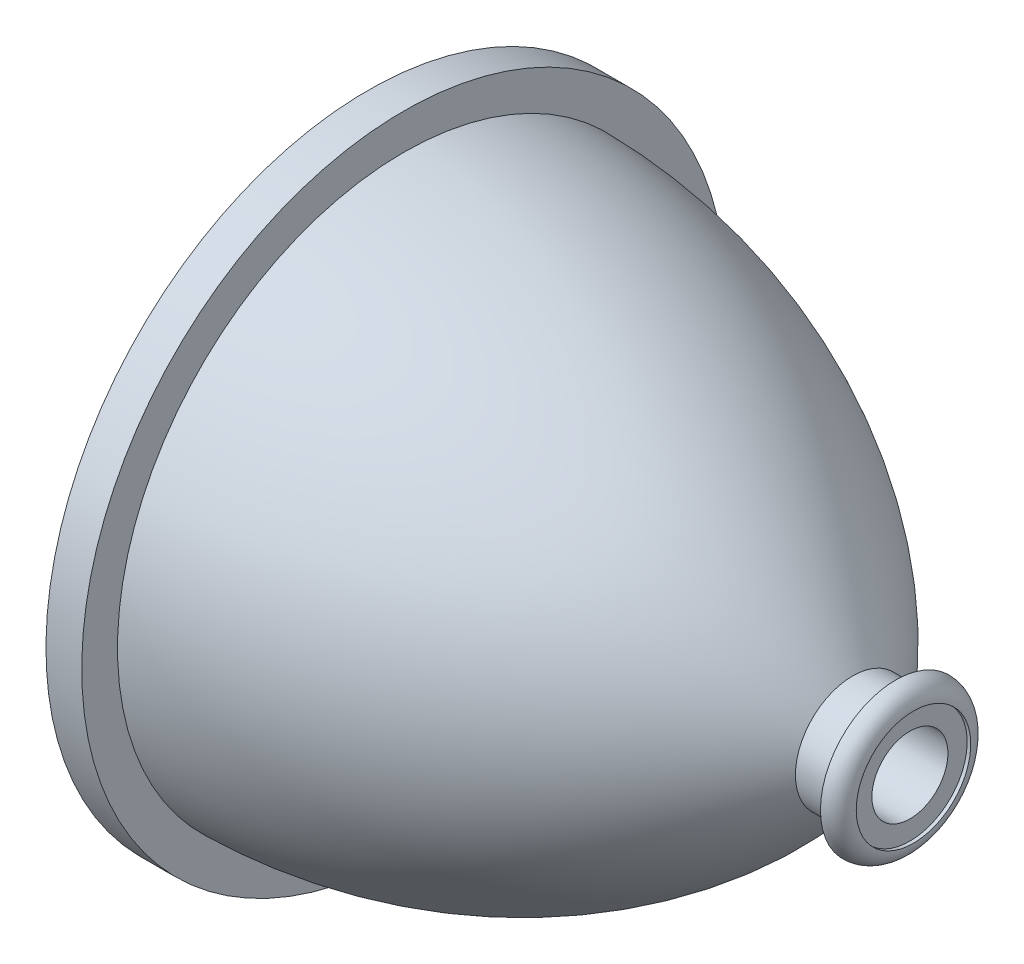
ISO-10303-21;
HEADER;
FILE_DESCRIPTION(('STEP AP214'),'2;1');
FILE_NAME('part.step','',(''),(''),'','','');
FILE_SCHEMA(('AUTOMOTIVE_DESIGN { 1 0 10303 214 1 1 1 1 }'));
ENDSEC;
DATA;
#1=APPLICATION_CONTEXT('core data for automotive mechanical design processes');
#2=APPLICATION_PROTOCOL_DEFINITION('international standard','automotive_design',2000,#1);
#3=PRODUCT_CONTEXT('',#1,'mechanical');
#4=PRODUCT('Part','Part','',(#3));
#5=PRODUCT_RELATED_PRODUCT_CATEGORY('part','',(#4));
#6=PRODUCT_DEFINITION_FORMATION('','',#4);
#7=PRODUCT_DEFINITION_CONTEXT('part definition',#1,'design');
#8=PRODUCT_DEFINITION('design','',#6,#7);
#9=PRODUCT_DEFINITION_SHAPE('','',#8);
#10=(LENGTH_UNIT() NAMED_UNIT(*) SI_UNIT(.MILLI.,.METRE.));
#11=(NAMED_UNIT(*) PLANE_ANGLE_UNIT() SI_UNIT($,.RADIAN.));
#12=(NAMED_UNIT(*) SI_UNIT($,.STERADIAN.) SOLID_ANGLE_UNIT());
#13=UNCERTAINTY_MEASURE_WITH_UNIT(LENGTH_MEASURE(1.E-05),#10,'distance_accuracy_value','');
#14=(GEOMETRIC_REPRESENTATION_CONTEXT(3) GLOBAL_UNCERTAINTY_ASSIGNED_CONTEXT((#13)) GLOBAL_UNIT_ASSIGNED_CONTEXT((#10,
#11,#12)) REPRESENTATION_CONTEXT('',''));
#15=CARTESIAN_POINT('',(0.,0.,0.));
#16=DIRECTION('',(0.,0.,1.));
#17=DIRECTION('',(1.,0.,0.));
#18=AXIS2_PLACEMENT_3D('',#15,#16,#17);
#19=CARTESIAN_POINT('',(-6.32456014520781,-0.000355181778851922,0.));
#20=DIRECTION('',(1.,0.,0.));
#21=DIRECTION('',(0.,1.,0.));
#22=AXIS2_PLACEMENT_3D('',#19,#20,#21);
#23=CYLINDRICAL_SURFACE('',#22,44.45);
#24=CARTESIAN_POINT('',(-6.32456014520781,-0.000355181778851922,0.));
#25=DIRECTION('',(-1.,0.,0.));
#26=DIRECTION('',(0.,-1.,0.));
#27=AXIS2_PLACEMENT_3D('',#24,#25,#26);
#28=CIRCLE('',#27,44.45);
#29=CARTESIAN_POINT('',(-6.32456014520781,-44.4503551817788,0.));
#30=VERTEX_POINT('',#29);
#31=EDGE_CURVE('E85',#30,#30,#28,.T.);
#32=ORIENTED_EDGE('',*,*,#31,.T.);
#33=EDGE_LOOP('',(#32));
#34=FACE_BOUND('',#33,.T.);
#35=CARTESIAN_POINT('',(0.,-0.000355181778851922,0.));
#36=DIRECTION('',(1.,0.,0.));
#37=DIRECTION('',(0.,0.,-1.));
#38=AXIS2_PLACEMENT_3D('',#35,#36,#37);
#39=CIRCLE('',#38,44.45);
#40=CARTESIAN_POINT('',(0.,-0.000355181778851922,-44.45));
#41=VERTEX_POINT('',#40);
#42=EDGE_CURVE('E90',#41,#41,#39,.T.);
#43=ORIENTED_EDGE('',*,*,#42,.T.);
#44=EDGE_LOOP('',(#43));
#45=FACE_BOUND('',#44,.T.);
#46=ADVANCED_FACE('F37',(#34,#45),#23,.F.);
#47=CARTESIAN_POINT('',(73.3416848801524,-0.000355181778851922,0.));
#48=DIRECTION('',(1.,0.,0.));
#49=DIRECTION('',(0.,1.,0.));
#50=AXIS2_PLACEMENT_3D('',#47,#48,#49);
#51=PLANE('',#50);
#52=CARTESIAN_POINT('',(73.3416848801524,-0.000355181778849412,0.));
#53=DIRECTION('',(1.,0.,0.));
#54=DIRECTION('',(0.,1.,0.));
#55=AXIS2_PLACEMENT_3D('',#52,#53,#54);
#56=CIRCLE('',#55,8.00582665572548);
#57=CARTESIAN_POINT('',(73.3416848801524,8.00547147394663,0.));
#58=VERTEX_POINT('',#57);
#59=EDGE_CURVE('E45',#58,#58,#56,.T.);
#60=ORIENTED_EDGE('',*,*,#59,.F.);
#61=EDGE_LOOP('',(#60));
#62=FACE_BOUND('',#61,.T.);
#63=CARTESIAN_POINT('',(73.3416848801524,-0.000355181778849412,0.));
#64=DIRECTION('',(-1.,0.,0.));
#65=DIRECTION('',(0.,0.,1.));
#66=AXIS2_PLACEMENT_3D('',#63,#64,#65);
#67=CIRCLE('',#66,7.61999999999999);
#68=CARTESIAN_POINT('',(73.3416848801524,-0.000355181778849412,7.61999999999999));
#69=VERTEX_POINT('',#68);
#70=EDGE_CURVE('E65',#69,#69,#67,.T.);
#71=ORIENTED_EDGE('',*,*,#70,.F.);
#72=EDGE_LOOP('',(#71));
#73=FACE_BOUND('',#72,.T.);
#74=ADVANCED_FACE('F111',(#62,#73),#51,.F.);
#75=CARTESIAN_POINT('',(-1.59804232648225,-0.000355181778849412,0.));
#76=DIRECTION('',(1.,0.,0.));
#77=DIRECTION('',(0.,1.,0.));
#78=AXIS2_PLACEMENT_3D('',#75,#76,#77);
#79=DEGENERATE_TOROIDAL_SURFACE('',#78,50.7870282349429,101.6,.F.);
#80=CARTESIAN_POINT('',(0.0254398547921975,-0.000355181778851922,0.));
#81=DIRECTION('',(1.,0.,0.));
#82=DIRECTION('',(0.,1.,0.));
#83=AXIS2_PLACEMENT_3D('',#80,#81,#82);
#84=CIRCLE('',#83,50.8);
#85=CARTESIAN_POINT('',(0.0254398547921975,50.7996448182211,0.));
#86=VERTEX_POINT('',#85);
#87=EDGE_CURVE('E52',#86,#86,#84,.T.);
#88=ORIENTED_EDGE('',*,*,#87,.T.);
#89=EDGE_LOOP('',(#88));
#90=FACE_BOUND('',#89,.T.);
#91=CARTESIAN_POINT('',(79.6916848801524,-0.000355181778851922,0.));
#92=DIRECTION('',(1.,0.,0.));
#93=DIRECTION('',(0.,1.,0.));
#94=AXIS2_PLACEMENT_3D('',#91,#92,#93);
#95=CIRCLE('',#94,10.16);
#96=CARTESIAN_POINT('',(79.6916848801524,10.1596448182211,0.));
#97=VERTEX_POINT('',#96);
#98=EDGE_CURVE('E10',#97,#97,#95,.T.);
#99=ORIENTED_EDGE('',*,*,#98,.F.);
#100=EDGE_LOOP('',(#99));
#101=FACE_BOUND('',#100,.T.);
#102=ADVANCED_FACE('F39',(#90,#101),#79,.F.);
#103=CARTESIAN_POINT('',(-1.59804232648225,-0.000355181778849412,0.));
#104=DIRECTION('',(1.,0.,0.));
#105=DIRECTION('',(0.,1.,0.));
#106=AXIS2_PLACEMENT_3D('',#103,#104,#105);
#107=DEGENERATE_TOROIDAL_SURFACE('',#106,50.7870282349429,95.25,.F.);
#108=CARTESIAN_POINT('',(2.54,-0.000355181778849412,0.));
#109=DIRECTION('',(1.,0.,0.));
#110=DIRECTION('',(0.,0.,-1.));
#111=AXIS2_PLACEMENT_3D('',#108,#109,#110);
#112=CIRCLE('',#111,44.3730427281677);
#113=CARTESIAN_POINT('',(2.54,-0.000355181778849412,-44.3730427281677));
#114=VERTEX_POINT('',#113);
#115=EDGE_CURVE('E41',#114,#114,#112,.F.);
#116=ORIENTED_EDGE('',*,*,#115,.T.);
#117=EDGE_LOOP('',(#116));
#118=FACE_BOUND('',#117,.T.);
#119=ORIENTED_EDGE('',*,*,#59,.T.);
#120=EDGE_LOOP('',(#119));
#121=FACE_BOUND('',#120,.T.);
#122=ADVANCED_FACE('F97',(#118,#121),#107,.T.);
#123=CARTESIAN_POINT('',(89.8516848801524,-0.000355181778851922,0.));
#124=DIRECTION('',(-1.,0.,0.));
#125=DIRECTION('',(0.,-1.,0.));
#126=AXIS2_PLACEMENT_3D('',#123,#124,#125);
#127=CYLINDRICAL_SURFACE('',#126,10.16);
#128=CARTESIAN_POINT('',(89.2166848801524,-0.000355181778851146,0.));
#129=DIRECTION('',(-1.,0.,0.));
#130=DIRECTION('',(0.,0.,1.));
#131=AXIS2_PLACEMENT_3D('',#128,#129,#130);
#132=CIRCLE('',#131,10.16);
#133=CARTESIAN_POINT('',(89.2166848801524,-0.000355181778851146,10.16));
#134=VERTEX_POINT('',#133);
#135=EDGE_CURVE('E77',#134,#134,#132,.T.);
#136=ORIENTED_EDGE('',*,*,#135,.T.);
#137=EDGE_LOOP('',(#136));
#138=FACE_BOUND('',#137,.T.);
#139=ORIENTED_EDGE('',*,*,#98,.T.);
#140=EDGE_LOOP('',(#139));
#141=FACE_BOUND('',#140,.T.);
#142=ADVANCED_FACE('F163',(#138,#141),#127,.T.);
#143=CARTESIAN_POINT('',(89.8516848801524,-0.000355181778851922,0.));
#144=DIRECTION('',(1.,0.,0.));
#145=DIRECTION('',(0.,1.,0.));
#146=AXIS2_PLACEMENT_3D('',#143,#144,#145);
#147=PLANE('',#146);
#148=CARTESIAN_POINT('',(89.8516848801524,-0.000355181778849412,0.));
#149=DIRECTION('',(-1.,0.,0.));
#150=DIRECTION('',(0.,0.,1.));
#151=AXIS2_PLACEMENT_3D('',#148,#149,#150);
#152=CIRCLE('',#151,6.74624);
#153=CARTESIAN_POINT('',(89.8516848801524,-0.000355181778849412,6.74624));
#154=VERTEX_POINT('',#153);
#155=EDGE_CURVE('E49',#154,#154,#152,.T.);
#156=ORIENTED_EDGE('',*,*,#155,.T.);
#157=EDGE_LOOP('',(#156));
#158=FACE_BOUND('',#157,.T.);
#159=CARTESIAN_POINT('',(89.8516848801524,-0.000355181778851146,0.));
#160=DIRECTION('',(1.,0.,0.));
#161=DIRECTION('',(0.,1.,0.));
#162=AXIS2_PLACEMENT_3D('',#159,#160,#161);
#163=CIRCLE('',#162,10.16);
#164=CARTESIAN_POINT('',(89.8516848801524,10.1596448182211,0.));
#165=VERTEX_POINT('',#164);
#166=EDGE_CURVE('E68',#165,#165,#163,.F.);
#167=ORIENTED_EDGE('',*,*,#166,.F.);
#168=EDGE_LOOP('',(#167));
#169=FACE_BOUND('',#168,.T.);
#170=ADVANCED_FACE('F159',(#158,#169),#147,.T.);
#171=CARTESIAN_POINT('',(73.3416848801524,-0.000355181778849412,0.));
#172=DIRECTION('',(-1.,0.,0.));
#173=DIRECTION('',(0.,0.,1.));
#174=AXIS2_PLACEMENT_3D('',#171,#172,#173);
#175=CYLINDRICAL_SURFACE('',#174,6.74624);
#176=ORIENTED_EDGE('',*,*,#155,.F.);
#177=EDGE_LOOP('',(#176));
#178=FACE_BOUND('',#177,.T.);
#179=CARTESIAN_POINT('',(78.4216848801524,-0.000355181778849412,0.));
#180=DIRECTION('',(-1.,0.,0.));
#181=DIRECTION('',(0.,0.,1.));
#182=AXIS2_PLACEMENT_3D('',#179,#180,#181);
#183=CIRCLE('',#182,6.74624);
#184=CARTESIAN_POINT('',(78.4216848801524,-0.000355181778849412,6.74624));
#185=VERTEX_POINT('',#184);
#186=EDGE_CURVE('E59',#185,#185,#183,.T.);
#187=ORIENTED_EDGE('',*,*,#186,.T.);
#188=EDGE_LOOP('',(#187));
#189=FACE_BOUND('',#188,.T.);
#190=ADVANCED_FACE('F155',(#178,#189),#175,.F.);
#191=CARTESIAN_POINT('',(78.4216848801524,6.74588481822115,0.));
#192=DIRECTION('',(1.,0.,0.));
#193=DIRECTION('',(0.,0.,-1.));
#194=AXIS2_PLACEMENT_3D('',#191,#192,#193);
#195=PLANE('',#194);
#196=ORIENTED_EDGE('',*,*,#186,.F.);
#197=EDGE_LOOP('',(#196));
#198=FACE_BOUND('',#197,.T.);
#199=CARTESIAN_POINT('',(78.4216848801524,-0.000355181778849412,0.));
#200=DIRECTION('',(-1.,0.,0.));
#201=DIRECTION('',(0.,0.,1.));
#202=AXIS2_PLACEMENT_3D('',#199,#200,#201);
#203=CIRCLE('',#202,7.62);
#204=CARTESIAN_POINT('',(78.4216848801524,-0.000355181778849412,7.62));
#205=VERTEX_POINT('',#204);
#206=EDGE_CURVE('E62',#205,#205,#203,.T.);
#207=ORIENTED_EDGE('',*,*,#206,.T.);
#208=EDGE_LOOP('',(#207));
#209=FACE_BOUND('',#208,.T.);
#210=ADVANCED_FACE('F151',(#198,#209),#195,.F.);
#211=CARTESIAN_POINT('',(73.3416848801524,-0.000355181778849412,0.));
#212=DIRECTION('',(-1.,0.,0.));
#213=DIRECTION('',(0.,0.,1.));
#214=AXIS2_PLACEMENT_3D('',#211,#212,#213);
#215=CYLINDRICAL_SURFACE('',#214,7.61999999999999);
#216=ORIENTED_EDGE('',*,*,#206,.F.);
#217=EDGE_LOOP('',(#216));
#218=FACE_BOUND('',#217,.T.);
#219=ORIENTED_EDGE('',*,*,#70,.T.);
#220=EDGE_LOOP('',(#219));
#221=FACE_BOUND('',#220,.T.);
#222=ADVANCED_FACE('F147',(#218,#221),#215,.F.);
#223=CARTESIAN_POINT('',(87.3116848801524,-0.000355181778851146,0.));
#224=DIRECTION('',(-1.,0.,0.));
#225=DIRECTION('',(0.,0.,1.));
#226=AXIS2_PLACEMENT_3D('',#223,#224,#225);
#227=TOROIDAL_SURFACE('',#226,10.16,3.175);
#228=CARTESIAN_POINT('',(87.3116848801524,-0.000355181778851146,0.));
#229=DIRECTION('',(-1.,0.,0.));
#230=DIRECTION('',(0.,0.,1.));
#231=AXIS2_PLACEMENT_3D('',#228,#229,#230);
#232=CIRCLE('',#231,13.335);
#233=CARTESIAN_POINT('',(87.3116848801524,-0.000355181778851146,13.335));
#234=VERTEX_POINT('',#233);
#235=EDGE_CURVE('E71',#234,#234,#232,.T.);
#236=ORIENTED_EDGE('',*,*,#235,.F.);
#237=EDGE_LOOP('',(#236));
#238=FACE_BOUND('',#237,.T.);
#239=CARTESIAN_POINT('',(90.4866848801524,-0.000355181778851146,0.));
#240=DIRECTION('',(-1.,0.,0.));
#241=DIRECTION('',(0.,0.,1.));
#242=AXIS2_PLACEMENT_3D('',#239,#240,#241);
#243=CIRCLE('',#242,10.16);
#244=CARTESIAN_POINT('',(90.4866848801524,-0.000355181778851146,10.16));
#245=VERTEX_POINT('',#244);
#246=EDGE_CURVE('E54',#245,#245,#243,.T.);
#247=ORIENTED_EDGE('',*,*,#246,.T.);
#248=EDGE_LOOP('',(#247));
#249=FACE_BOUND('',#248,.T.);
#250=ADVANCED_FACE('F143',(#238,#249),#227,.T.);
#251=CARTESIAN_POINT('',(87.3116848801524,12.0646448182211,0.));
#252=DIRECTION('',(-1.,0.,0.));
#253=DIRECTION('',(0.,0.,1.));
#254=AXIS2_PLACEMENT_3D('',#251,#252,#253);
#255=PLANE('',#254);
#256=ORIENTED_EDGE('',*,*,#235,.T.);
#257=EDGE_LOOP('',(#256));
#258=FACE_BOUND('',#257,.T.);
#259=CARTESIAN_POINT('',(87.3116848801524,-0.000355181778851146,0.));
#260=DIRECTION('',(-1.,0.,0.));
#261=DIRECTION('',(0.,0.,1.));
#262=AXIS2_PLACEMENT_3D('',#259,#260,#261);
#263=CIRCLE('',#262,12.065);
#264=CARTESIAN_POINT('',(87.3116848801524,-0.000355181778851146,12.065));
#265=VERTEX_POINT('',#264);
#266=EDGE_CURVE('E74',#265,#265,#263,.T.);
#267=ORIENTED_EDGE('',*,*,#266,.F.);
#268=EDGE_LOOP('',(#267));
#269=FACE_BOUND('',#268,.T.);
#270=ADVANCED_FACE('F139',(#258,#269),#255,.T.);
#271=CARTESIAN_POINT('',(87.3116848801524,-0.000355181778851146,0.));
#272=DIRECTION('',(-1.,0.,0.));
#273=DIRECTION('',(0.,0.,1.));
#274=AXIS2_PLACEMENT_3D('',#271,#272,#273);
#275=TOROIDAL_SURFACE('',#274,10.16,1.905);
#276=ORIENTED_EDGE('',*,*,#266,.T.);
#277=EDGE_LOOP('',(#276));
#278=FACE_BOUND('',#277,.T.);
#279=ORIENTED_EDGE('',*,*,#135,.F.);
#280=EDGE_LOOP('',(#279));
#281=FACE_BOUND('',#280,.T.);
#282=ADVANCED_FACE('F135',(#278,#281),#275,.F.);
#283=CARTESIAN_POINT('',(79.6916848801524,-0.000355181778851146,0.));
#284=DIRECTION('',(-1.,0.,0.));
#285=DIRECTION('',(0.,0.,1.));
#286=AXIS2_PLACEMENT_3D('',#283,#284,#285);
#287=CYLINDRICAL_SURFACE('',#286,10.16);
#288=ORIENTED_EDGE('',*,*,#166,.T.);
#289=EDGE_LOOP('',(#288));
#290=FACE_BOUND('',#289,.T.);
#291=ORIENTED_EDGE('',*,*,#246,.F.);
#292=EDGE_LOOP('',(#291));
#293=FACE_BOUND('',#292,.T.);
#294=ADVANCED_FACE('F125',(#290,#293),#287,.F.);
#295=CARTESIAN_POINT('',(-6.32456014520781,-0.000355181778851922,0.));
#296=DIRECTION('',(-1.,0.,0.));
#297=DIRECTION('',(0.,-1.,0.));
#298=AXIS2_PLACEMENT_3D('',#295,#296,#297);
#299=PLANE('',#298);
#300=CARTESIAN_POINT('',(-6.32456014520781,-0.000355181778851922,0.));
#301=DIRECTION('',(-1.,0.,0.));
#302=DIRECTION('',(0.,-1.,0.));
#303=AXIS2_PLACEMENT_3D('',#300,#301,#302);
#304=CIRCLE('',#303,57.15);
#305=CARTESIAN_POINT('',(-6.32456014520781,-57.1503551817789,0.));
#306=VERTEX_POINT('',#305);
#307=EDGE_CURVE('E55',#306,#306,#304,.T.);
#308=ORIENTED_EDGE('',*,*,#307,.T.);
#309=EDGE_LOOP('',(#308));
#310=FACE_BOUND('',#309,.T.);
#311=ORIENTED_EDGE('',*,*,#31,.F.);
#312=EDGE_LOOP('',(#311));
#313=FACE_BOUND('',#312,.T.);
#314=ADVANCED_FACE('F121',(#310,#313),#299,.T.);
#315=CARTESIAN_POINT('',(0.0254398547921943,-0.000355181778851922,0.));
#316=DIRECTION('',(-1.,0.,0.));
#317=DIRECTION('',(0.,-1.,0.));
#318=AXIS2_PLACEMENT_3D('',#315,#316,#317);
#319=PLANE('',#318);
#320=ORIENTED_EDGE('',*,*,#87,.F.);
#321=EDGE_LOOP('',(#320));
#322=FACE_BOUND('',#321,.T.);
#323=CARTESIAN_POINT('',(0.0254398547921943,-0.000355181778851922,0.));
#324=DIRECTION('',(-1.,0.,0.));
#325=DIRECTION('',(0.,-1.,0.));
#326=AXIS2_PLACEMENT_3D('',#323,#324,#325);
#327=CIRCLE('',#326,57.15);
#328=CARTESIAN_POINT('',(0.0254398547921943,-57.1503551817789,0.));
#329=VERTEX_POINT('',#328);
#330=EDGE_CURVE('E82',#329,#329,#327,.T.);
#331=ORIENTED_EDGE('',*,*,#330,.F.);
#332=EDGE_LOOP('',(#331));
#333=FACE_BOUND('',#332,.T.);
#334=ADVANCED_FACE('F124',(#322,#333),#319,.F.);
#335=CARTESIAN_POINT('',(-6.32456014520781,-0.000355181778851922,0.));
#336=DIRECTION('',(1.,0.,0.));
#337=DIRECTION('',(0.,1.,0.));
#338=AXIS2_PLACEMENT_3D('',#335,#336,#337);
#339=CYLINDRICAL_SURFACE('',#338,57.15);
#340=ORIENTED_EDGE('',*,*,#307,.F.);
#341=EDGE_LOOP('',(#340));
#342=FACE_BOUND('',#341,.T.);
#343=ORIENTED_EDGE('',*,*,#330,.T.);
#344=EDGE_LOOP('',(#343));
#345=FACE_BOUND('',#344,.T.);
#346=ADVANCED_FACE('F107',(#342,#345),#339,.T.);
#347=CARTESIAN_POINT('',(0.,-0.000355181778851922,0.));
#348=DIRECTION('',(1.,0.,0.));
#349=DIRECTION('',(0.,0.,-1.));
#350=AXIS2_PLACEMENT_3D('',#347,#348,#349);
#351=PLANE('',#350);
#352=ORIENTED_EDGE('',*,*,#42,.F.);
#353=EDGE_LOOP('',(#352));
#354=FACE_BOUND('',#353,.T.);
#355=ADVANCED_FACE('F102',(#354),#351,.F.);
#356=CARTESIAN_POINT('',(2.54,-0.000355181778851922,0.));
#357=DIRECTION('',(1.,0.,0.));
#358=DIRECTION('',(0.,0.,-1.));
#359=AXIS2_PLACEMENT_3D('',#356,#357,#358);
#360=PLANE('',#359);
#361=ORIENTED_EDGE('',*,*,#115,.F.);
#362=EDGE_LOOP('',(#361));
#363=FACE_BOUND('',#362,.T.);
#364=ADVANCED_FACE('F100',(#363),#360,.T.);
#365=CLOSED_SHELL('',(#46,#74,#102,#122,#142,#170,#190,#210,#222,#250,#270,#282,#294,#314,#334,
#346,#355,#364));
#366=MANIFOLD_SOLID_BREP('B2',#365);
#367=ADVANCED_BREP_SHAPE_REPRESENTATION('',(#18,#366),#14);
#368=SHAPE_DEFINITION_REPRESENTATION(#9,#367);
ENDSEC;
END-ISO-10303-21;
